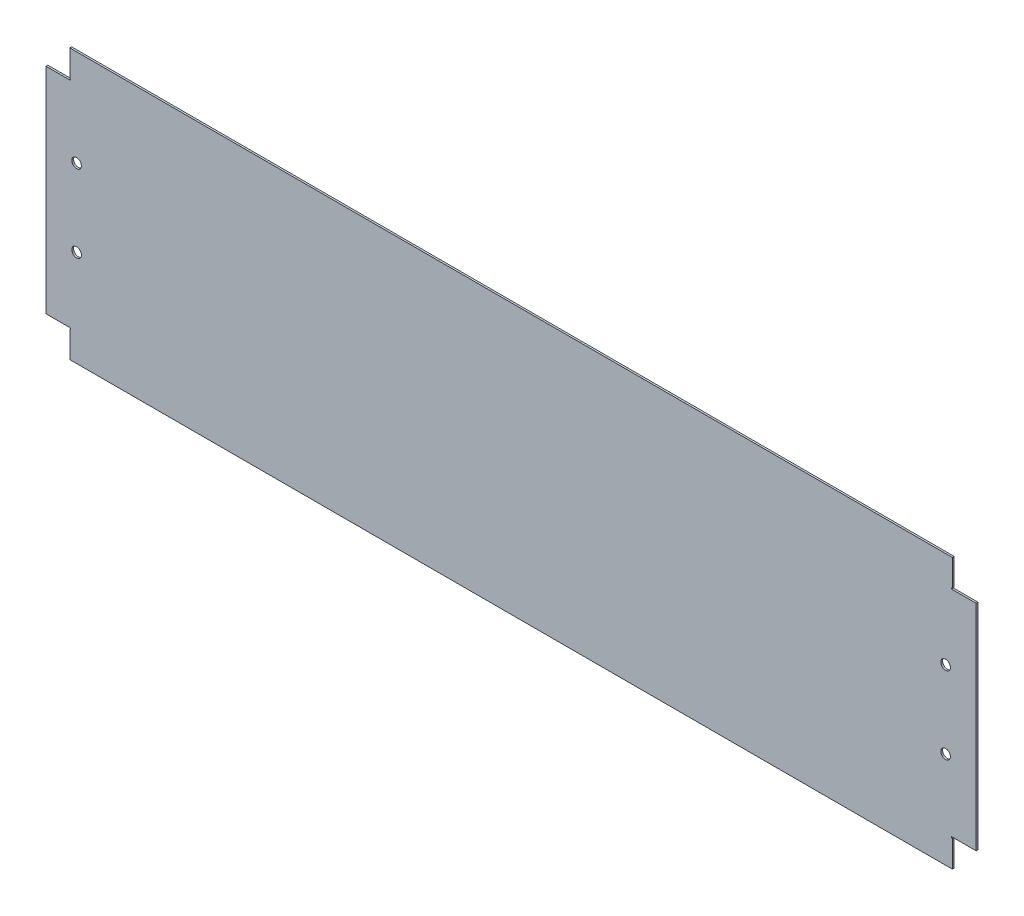
ISO-10303-21;
HEADER;
FILE_DESCRIPTION(('STEP AP214'),'2;1');
FILE_NAME('part.step','',(''),(''),'','','');
FILE_SCHEMA(('AUTOMOTIVE_DESIGN { 1 0 10303 214 1 1 1 1 }'));
ENDSEC;
DATA;
#1=APPLICATION_CONTEXT('core data for automotive mechanical design processes');
#2=APPLICATION_PROTOCOL_DEFINITION('international standard','automotive_design',2000,#1);
#3=PRODUCT_CONTEXT('',#1,'mechanical');
#4=PRODUCT('Part','Part','',(#3));
#5=PRODUCT_RELATED_PRODUCT_CATEGORY('part','',(#4));
#6=PRODUCT_DEFINITION_FORMATION('','',#4);
#7=PRODUCT_DEFINITION_CONTEXT('part definition',#1,'design');
#8=PRODUCT_DEFINITION('design','',#6,#7);
#9=PRODUCT_DEFINITION_SHAPE('','',#8);
#10=(LENGTH_UNIT() NAMED_UNIT(*) SI_UNIT(.MILLI.,.METRE.));
#11=(NAMED_UNIT(*) PLANE_ANGLE_UNIT() SI_UNIT($,.RADIAN.));
#12=(NAMED_UNIT(*) SI_UNIT($,.STERADIAN.) SOLID_ANGLE_UNIT());
#13=UNCERTAINTY_MEASURE_WITH_UNIT(LENGTH_MEASURE(1.E-05),#10,'distance_accuracy_value','');
#14=(GEOMETRIC_REPRESENTATION_CONTEXT(3) GLOBAL_UNCERTAINTY_ASSIGNED_CONTEXT((#13)) GLOBAL_UNIT_ASSIGNED_CONTEXT((#10,
#11,#12)) REPRESENTATION_CONTEXT('',''));
#15=CARTESIAN_POINT('',(0.,0.,0.));
#16=DIRECTION('',(0.,0.,1.));
#17=DIRECTION('',(1.,0.,0.));
#18=AXIS2_PLACEMENT_3D('',#15,#16,#17);
#19=CARTESIAN_POINT('',(-362.077,88.9,-1.52399999999997));
#20=DIRECTION('',(-1.,0.,0.));
#21=DIRECTION('',(0.,0.,1.));
#22=AXIS2_PLACEMENT_3D('',#19,#20,#21);
#23=PLANE('',#22);
#24=DIRECTION('',(0.,0.,1.));
#25=VECTOR('',#24,1.);
#26=CARTESIAN_POINT('',(-362.077,88.138,-1.52399999999997));
#27=LINE('',#26,#25);
#28=CARTESIAN_POINT('',(-362.077,88.138,-1.524));
#29=VERTEX_POINT('',#28);
#30=CARTESIAN_POINT('',(-362.077,88.138,0.));
#31=VERTEX_POINT('',#30);
#32=EDGE_CURVE('E394',#29,#31,#27,.T.);
#33=ORIENTED_EDGE('',*,*,#32,.T.);
#34=DIRECTION('',(0.,1.,0.));
#35=VECTOR('',#34,1.);
#36=CARTESIAN_POINT('',(-362.077,0.,0.));
#37=LINE('',#36,#35);
#38=CARTESIAN_POINT('',(-362.077,88.9,0.));
#39=VERTEX_POINT('',#38);
#40=EDGE_CURVE('E13',#31,#39,#37,.T.);
#41=ORIENTED_EDGE('',*,*,#40,.T.);
#42=DIRECTION('',(0.,0.,1.));
#43=VECTOR('',#42,1.);
#44=CARTESIAN_POINT('',(-362.077,88.9,-1.52399999999997));
#45=LINE('',#44,#43);
#46=CARTESIAN_POINT('',(-362.077,88.9,-1.524));
#47=VERTEX_POINT('',#46);
#48=EDGE_CURVE('E391',#47,#39,#45,.T.);
#49=ORIENTED_EDGE('',*,*,#48,.F.);
#50=DIRECTION('',(0.,-1.,0.));
#51=VECTOR('',#50,1.);
#52=CARTESIAN_POINT('',(-362.077,88.9,-1.52399999999997));
#53=LINE('',#52,#51);
#54=EDGE_CURVE('E151',#47,#29,#53,.T.);
#55=ORIENTED_EDGE('',*,*,#54,.T.);
#56=EDGE_LOOP('',(#33,#41,#49,#55));
#57=FACE_BOUND('',#56,.T.);
#58=ADVANCED_FACE('F135',(#57),#23,.T.);
#59=CARTESIAN_POINT('',(-362.077,-88.138,-1.52399999999997));
#60=DIRECTION('',(-1.,0.,0.));
#61=DIRECTION('',(0.,0.,1.));
#62=AXIS2_PLACEMENT_3D('',#59,#60,#61);
#63=PLANE('',#62);
#64=DIRECTION('',(0.,0.,1.));
#65=VECTOR('',#64,1.);
#66=CARTESIAN_POINT('',(-362.077,-88.9,-1.52399999999997));
#67=LINE('',#66,#65);
#68=CARTESIAN_POINT('',(-362.077,-88.9,-1.524));
#69=VERTEX_POINT('',#68);
#70=CARTESIAN_POINT('',(-362.077,-88.9,0.));
#71=VERTEX_POINT('',#70);
#72=EDGE_CURVE('E384',#69,#71,#67,.T.);
#73=ORIENTED_EDGE('',*,*,#72,.T.);
#74=DIRECTION('',(0.,1.,0.));
#75=VECTOR('',#74,1.);
#76=CARTESIAN_POINT('',(-362.077,0.,0.));
#77=LINE('',#76,#75);
#78=CARTESIAN_POINT('',(-362.077,-88.138,0.));
#79=VERTEX_POINT('',#78);
#80=EDGE_CURVE('E144',#71,#79,#77,.T.);
#81=ORIENTED_EDGE('',*,*,#80,.T.);
#82=DIRECTION('',(0.,0.,1.));
#83=VECTOR('',#82,1.);
#84=CARTESIAN_POINT('',(-362.077,-88.138,-1.52399999999997));
#85=LINE('',#84,#83);
#86=CARTESIAN_POINT('',(-362.077,-88.138,-1.524));
#87=VERTEX_POINT('',#86);
#88=EDGE_CURVE('E403',#87,#79,#85,.T.);
#89=ORIENTED_EDGE('',*,*,#88,.F.);
#90=DIRECTION('',(0.,-1.,0.));
#91=VECTOR('',#90,1.);
#92=CARTESIAN_POINT('',(-362.077,-88.138,-1.52399999999997));
#93=LINE('',#92,#91);
#94=EDGE_CURVE('E399',#87,#69,#93,.T.);
#95=ORIENTED_EDGE('',*,*,#94,.T.);
#96=EDGE_LOOP('',(#73,#81,#89,#95));
#97=FACE_BOUND('',#96,.T.);
#98=ADVANCED_FACE('F534',(#97),#63,.T.);
#99=CARTESIAN_POINT('',(-362.077,-88.9,-1.52399999999997));
#100=DIRECTION('',(0.,1.,0.));
#101=DIRECTION('',(0.,0.,1.));
#102=AXIS2_PLACEMENT_3D('',#99,#100,#101);
#103=PLANE('',#102);
#104=DIRECTION('',(0.,0.,1.));
#105=VECTOR('',#104,1.);
#106=CARTESIAN_POINT('',(-362.839,-88.9,-1.524));
#107=LINE('',#106,#105);
#108=CARTESIAN_POINT('',(-362.839,-88.9,-1.524));
#109=VERTEX_POINT('',#108);
#110=CARTESIAN_POINT('',(-362.839,-88.9,0.));
#111=VERTEX_POINT('',#110);
#112=EDGE_CURVE('E526',#109,#111,#107,.T.);
#113=ORIENTED_EDGE('',*,*,#112,.T.);
#114=DIRECTION('',(1.,0.,0.));
#115=VECTOR('',#114,1.);
#116=CARTESIAN_POINT('',(0.,-88.9,0.));
#117=LINE('',#116,#115);
#118=EDGE_CURVE('E430',#111,#71,#117,.T.);
#119=ORIENTED_EDGE('',*,*,#118,.T.);
#120=ORIENTED_EDGE('',*,*,#72,.F.);
#121=DIRECTION('',(-1.,0.,0.));
#122=VECTOR('',#121,1.);
#123=CARTESIAN_POINT('',(-362.077,-88.9,-1.52399999999997));
#124=LINE('',#123,#122);
#125=EDGE_CURVE('E404',#69,#109,#124,.T.);
#126=ORIENTED_EDGE('',*,*,#125,.T.);
#127=EDGE_LOOP('',(#113,#119,#120,#126));
#128=FACE_BOUND('',#127,.T.);
#129=ADVANCED_FACE('F542',(#128),#103,.T.);
#130=CARTESIAN_POINT('',(-365.887,88.9,-1.52399999999997));
#131=DIRECTION('',(0.,-1.,0.));
#132=DIRECTION('',(0.,0.,-1.));
#133=AXIS2_PLACEMENT_3D('',#130,#131,#132);
#134=PLANE('',#133);
#135=ORIENTED_EDGE('',*,*,#48,.T.);
#136=DIRECTION('',(-1.,0.,0.));
#137=VECTOR('',#136,1.);
#138=CARTESIAN_POINT('',(0.,88.9,0.));
#139=LINE('',#138,#137);
#140=CARTESIAN_POINT('',(-362.839,88.9,0.));
#141=VERTEX_POINT('',#140);
#142=EDGE_CURVE('E426',#39,#141,#139,.T.);
#143=ORIENTED_EDGE('',*,*,#142,.T.);
#144=DIRECTION('',(0.,0.,-1.));
#145=VECTOR('',#144,1.);
#146=CARTESIAN_POINT('',(-362.839,88.9,-1.524));
#147=LINE('',#146,#145);
#148=CARTESIAN_POINT('',(-362.839,88.9,-1.52399999999997));
#149=VERTEX_POINT('',#148);
#150=EDGE_CURVE('E522',#141,#149,#147,.T.);
#151=ORIENTED_EDGE('',*,*,#150,.T.);
#152=DIRECTION('',(1.,0.,0.));
#153=VECTOR('',#152,1.);
#154=CARTESIAN_POINT('',(-365.887,88.9,-1.52399999999997));
#155=LINE('',#154,#153);
#156=EDGE_CURVE('E385',#149,#47,#155,.T.);
#157=ORIENTED_EDGE('',*,*,#156,.T.);
#158=EDGE_LOOP('',(#135,#143,#151,#157));
#159=FACE_BOUND('',#158,.T.);
#160=ADVANCED_FACE('F595',(#159),#134,.T.);
#161=CARTESIAN_POINT('',(-362.077,88.138,-1.52399999999997));
#162=DIRECTION('',(0.,1.,0.));
#163=DIRECTION('',(0.,0.,1.));
#164=AXIS2_PLACEMENT_3D('',#161,#162,#163);
#165=PLANE('',#164);
#166=DIRECTION('',(-1.,0.,0.));
#167=VECTOR('',#166,1.);
#168=CARTESIAN_POINT('',(-362.077,88.138,-1.52399999999997));
#169=LINE('',#168,#167);
#170=CARTESIAN_POINT('',(-382.383962531012,88.138,-1.52399999999991));
#171=VERTEX_POINT('',#170);
#172=EDGE_CURVE('E156',#29,#171,#169,.T.);
#173=ORIENTED_EDGE('',*,*,#172,.T.);
#174=DIRECTION('',(0.,0.,-1.));
#175=VECTOR('',#174,1.);
#176=CARTESIAN_POINT('',(-382.383962531012,88.138,1.11022302462516E-13));
#177=LINE('',#176,#175);
#178=CARTESIAN_POINT('',(-382.383962531012,88.138,1.66533453693773E-13));
#179=VERTEX_POINT('',#178);
#180=EDGE_CURVE('E346',#179,#171,#177,.T.);
#181=ORIENTED_EDGE('',*,*,#180,.F.);
#182=DIRECTION('',(1.,0.,0.));
#183=VECTOR('',#182,1.);
#184=CARTESIAN_POINT('',(0.,88.138,0.));
#185=LINE('',#184,#183);
#186=EDGE_CURVE('E422',#179,#31,#185,.T.);
#187=ORIENTED_EDGE('',*,*,#186,.T.);
#188=ORIENTED_EDGE('',*,*,#32,.F.);
#189=EDGE_LOOP('',(#173,#181,#187,#188));
#190=FACE_BOUND('',#189,.T.);
#191=ADVANCED_FACE('F593',(#190),#165,.T.);
#192=CARTESIAN_POINT('',(-362.839,-88.138,-1.52399999999997));
#193=DIRECTION('',(0.,-1.,0.));
#194=DIRECTION('',(0.,0.,-1.));
#195=AXIS2_PLACEMENT_3D('',#192,#193,#194);
#196=PLANE('',#195);
#197=ORIENTED_EDGE('',*,*,#88,.T.);
#198=DIRECTION('',(-1.,0.,0.));
#199=VECTOR('',#198,1.);
#200=CARTESIAN_POINT('',(0.,-88.138,0.));
#201=LINE('',#200,#199);
#202=CARTESIAN_POINT('',(-382.383962531012,-88.1380000000001,1.11022302462516E-13));
#203=VERTEX_POINT('',#202);
#204=EDGE_CURVE('E388',#79,#203,#201,.T.);
#205=ORIENTED_EDGE('',*,*,#204,.T.);
#206=DIRECTION('',(0.,0.,-1.));
#207=VECTOR('',#206,1.);
#208=CARTESIAN_POINT('',(-382.383962531012,-88.1380000000001,0.));
#209=LINE('',#208,#207);
#210=CARTESIAN_POINT('',(-382.383962531012,-88.1380000000001,-1.52399999999991));
#211=VERTEX_POINT('',#210);
#212=EDGE_CURVE('E338',#203,#211,#209,.T.);
#213=ORIENTED_EDGE('',*,*,#212,.T.);
#214=DIRECTION('',(1.,0.,0.));
#215=VECTOR('',#214,1.);
#216=CARTESIAN_POINT('',(-362.839,-88.138,-1.52399999999997));
#217=LINE('',#216,#215);
#218=EDGE_CURVE('E395',#211,#87,#217,.T.);
#219=ORIENTED_EDGE('',*,*,#218,.T.);
#220=EDGE_LOOP('',(#197,#205,#213,#219));
#221=FACE_BOUND('',#220,.T.);
#222=ADVANCED_FACE('F537',(#221),#196,.T.);
#223=CARTESIAN_POINT('',(0.,0.,-1.524));
#224=DIRECTION('',(0.,0.,-1.));
#225=DIRECTION('',(-1.,0.,0.));
#226=AXIS2_PLACEMENT_3D('',#223,#224,#225);
#227=PLANE('',#226);
#228=CARTESIAN_POINT('',(-357.251,-31.75,-1.524));
#229=DIRECTION('',(0.,0.,-1.));
#230=DIRECTION('',(-1.,0.,0.));
#231=AXIS2_PLACEMENT_3D('',#228,#229,#230);
#232=CIRCLE('',#231,3.9624);
#233=CARTESIAN_POINT('',(-361.2134,-31.75,-1.524));
#234=VERTEX_POINT('',#233);
#235=EDGE_CURVE('E380',#234,#234,#232,.T.);
#236=ORIENTED_EDGE('',*,*,#235,.F.);
#237=EDGE_LOOP('',(#236));
#238=FACE_BOUND('',#237,.T.);
#239=CARTESIAN_POINT('',(357.251,31.75,-1.524));
#240=DIRECTION('',(0.,0.,-1.));
#241=DIRECTION('',(-1.,0.,0.));
#242=AXIS2_PLACEMENT_3D('',#239,#240,#241);
#243=CIRCLE('',#242,3.9624);
#244=CARTESIAN_POINT('',(353.2886,31.75,-1.524));
#245=VERTEX_POINT('',#244);
#246=EDGE_CURVE('E376',#245,#245,#243,.T.);
#247=ORIENTED_EDGE('',*,*,#246,.F.);
#248=EDGE_LOOP('',(#247));
#249=FACE_BOUND('',#248,.T.);
#250=CARTESIAN_POINT('',(357.251,-31.75,-1.524));
#251=DIRECTION('',(0.,0.,-1.));
#252=DIRECTION('',(-1.,0.,0.));
#253=AXIS2_PLACEMENT_3D('',#250,#251,#252);
#254=CIRCLE('',#253,3.9624);
#255=CARTESIAN_POINT('',(353.2886,-31.75,-1.524));
#256=VERTEX_POINT('',#255);
#257=EDGE_CURVE('E372',#256,#256,#254,.T.);
#258=ORIENTED_EDGE('',*,*,#257,.F.);
#259=EDGE_LOOP('',(#258));
#260=FACE_BOUND('',#259,.T.);
#261=CARTESIAN_POINT('',(-357.251,31.75,-1.524));
#262=DIRECTION('',(0.,0.,-1.));
#263=DIRECTION('',(-1.,0.,0.));
#264=AXIS2_PLACEMENT_3D('',#261,#262,#263);
#265=CIRCLE('',#264,3.9624);
#266=CARTESIAN_POINT('',(-361.2134,31.75,-1.524));
#267=VERTEX_POINT('',#266);
#268=EDGE_CURVE('E368',#267,#267,#265,.T.);
#269=ORIENTED_EDGE('',*,*,#268,.F.);
#270=EDGE_LOOP('',(#269));
#271=FACE_BOUND('',#270,.T.);
#272=ORIENTED_EDGE('',*,*,#54,.F.);
#273=ORIENTED_EDGE('',*,*,#156,.F.);
#274=DIRECTION('',(0.,1.,0.));
#275=VECTOR('',#274,1.);
#276=CARTESIAN_POINT('',(-362.839,94.488,-1.524));
#277=LINE('',#276,#275);
#278=CARTESIAN_POINT('',(-362.839,110.984962531012,-1.5239999999999));
#279=VERTEX_POINT('',#278);
#280=EDGE_CURVE('E502',#149,#279,#277,.T.);
#281=ORIENTED_EDGE('',*,*,#280,.T.);
#282=DIRECTION('',(-1.,0.,0.));
#283=VECTOR('',#282,1.);
#284=CARTESIAN_POINT('',(0.,110.984962531012,-1.5239999999999));
#285=LINE('',#284,#283);
#286=CARTESIAN_POINT('',(362.839,110.984962531012,-1.5239999999999));
#287=VERTEX_POINT('',#286);
#288=EDGE_CURVE('E294',#279,#287,#285,.F.);
#289=ORIENTED_EDGE('',*,*,#288,.T.);
#290=DIRECTION('',(0.,-1.,0.));
#291=VECTOR('',#290,1.);
#292=CARTESIAN_POINT('',(362.839,94.488,-1.524));
#293=LINE('',#292,#291);
#294=CARTESIAN_POINT('',(362.839,88.9,-1.524));
#295=VERTEX_POINT('',#294);
#296=EDGE_CURVE('E284',#287,#295,#293,.T.);
#297=ORIENTED_EDGE('',*,*,#296,.T.);
#298=DIRECTION('',(1.,0.,0.));
#299=VECTOR('',#298,1.);
#300=CARTESIAN_POINT('',(362.077,88.9,-1.52399999999997));
#301=LINE('',#300,#299);
#302=CARTESIAN_POINT('',(362.077,88.9,-1.524));
#303=VERTEX_POINT('',#302);
#304=EDGE_CURVE('E458',#303,#295,#301,.T.);
#305=ORIENTED_EDGE('',*,*,#304,.F.);
#306=DIRECTION('',(0.,1.,0.));
#307=VECTOR('',#306,1.);
#308=CARTESIAN_POINT('',(362.077,88.138,-1.52399999999997));
#309=LINE('',#308,#307);
#310=CARTESIAN_POINT('',(362.077,88.138,-1.524));
#311=VERTEX_POINT('',#310);
#312=EDGE_CURVE('E453',#311,#303,#309,.T.);
#313=ORIENTED_EDGE('',*,*,#312,.F.);
#314=DIRECTION('',(-1.,0.,0.));
#315=VECTOR('',#314,1.);
#316=CARTESIAN_POINT('',(362.839,88.138,-1.52399999999997));
#317=LINE('',#316,#315);
#318=CARTESIAN_POINT('',(382.383962531012,88.138,-1.52399999999991));
#319=VERTEX_POINT('',#318);
#320=EDGE_CURVE('E449',#319,#311,#317,.T.);
#321=ORIENTED_EDGE('',*,*,#320,.F.);
#322=DIRECTION('',(0.,-1.,0.));
#323=VECTOR('',#322,1.);
#324=CARTESIAN_POINT('',(382.383962531012,1.1249206817415E-13,-1.52399999999991));
#325=LINE('',#324,#323);
#326=CARTESIAN_POINT('',(382.383962531012,-88.138,-1.52399999999991));
#327=VERTEX_POINT('',#326);
#328=EDGE_CURVE('E310',#319,#327,#325,.T.);
#329=ORIENTED_EDGE('',*,*,#328,.T.);
#330=DIRECTION('',(1.,0.,0.));
#331=VECTOR('',#330,1.);
#332=CARTESIAN_POINT('',(362.077,-88.138,-1.52399999999997));
#333=LINE('',#332,#331);
#334=CARTESIAN_POINT('',(362.077,-88.138,-1.524));
#335=VERTEX_POINT('',#334);
#336=EDGE_CURVE('E445',#335,#327,#333,.T.);
#337=ORIENTED_EDGE('',*,*,#336,.F.);
#338=DIRECTION('',(0.,1.,0.));
#339=VECTOR('',#338,1.);
#340=CARTESIAN_POINT('',(362.077,-88.9,-1.52399999999997));
#341=LINE('',#340,#339);
#342=CARTESIAN_POINT('',(362.077,-88.9,-1.524));
#343=VERTEX_POINT('',#342);
#344=EDGE_CURVE('E440',#343,#335,#341,.T.);
#345=ORIENTED_EDGE('',*,*,#344,.F.);
#346=DIRECTION('',(-1.,0.,0.));
#347=VECTOR('',#346,1.);
#348=CARTESIAN_POINT('',(365.887,-88.9,-1.52399999999997));
#349=LINE('',#348,#347);
#350=CARTESIAN_POINT('',(362.839,-88.9,-1.52399999999997));
#351=VERTEX_POINT('',#350);
#352=EDGE_CURVE('E435',#351,#343,#349,.T.);
#353=ORIENTED_EDGE('',*,*,#352,.F.);
#354=DIRECTION('',(0.,-1.,0.));
#355=VECTOR('',#354,1.);
#356=CARTESIAN_POINT('',(362.839,-94.488,-1.524));
#357=LINE('',#356,#355);
#358=CARTESIAN_POINT('',(362.839,-110.984962531012,-1.5239999999999));
#359=VERTEX_POINT('',#358);
#360=EDGE_CURVE('E486',#351,#359,#357,.T.);
#361=ORIENTED_EDGE('',*,*,#360,.T.);
#362=DIRECTION('',(-1.,0.,0.));
#363=VECTOR('',#362,1.);
#364=CARTESIAN_POINT('',(0.,-110.984962531012,-1.5239999999999));
#365=LINE('',#364,#363);
#366=CARTESIAN_POINT('',(-362.839,-110.984962531012,-1.5239999999999));
#367=VERTEX_POINT('',#366);
#368=EDGE_CURVE('E327',#359,#367,#365,.T.);
#369=ORIENTED_EDGE('',*,*,#368,.T.);
#370=DIRECTION('',(0.,1.,0.));
#371=VECTOR('',#370,1.);
#372=CARTESIAN_POINT('',(-362.839,-94.488,-1.524));
#373=LINE('',#372,#371);
#374=EDGE_CURVE('E490',#367,#109,#373,.T.);
#375=ORIENTED_EDGE('',*,*,#374,.T.);
#376=ORIENTED_EDGE('',*,*,#125,.F.);
#377=ORIENTED_EDGE('',*,*,#94,.F.);
#378=ORIENTED_EDGE('',*,*,#218,.F.);
#379=DIRECTION('',(0.,1.,0.));
#380=VECTOR('',#379,1.);
#381=CARTESIAN_POINT('',(-382.383962531012,-1.1249206817415E-13,-1.52399999999991));
#382=LINE('',#381,#380);
#383=EDGE_CURVE('E343',#211,#171,#382,.T.);
#384=ORIENTED_EDGE('',*,*,#383,.T.);
#385=ORIENTED_EDGE('',*,*,#172,.F.);
#386=EDGE_LOOP('',(#272,#273,#281,#289,#297,#305,#313,#321,#329,#337,#345,#353,#361,#369,#375,
#376,#377,#378,#384,#385));
#387=FACE_BOUND('',#386,.T.);
#388=ADVANCED_FACE('F540',(#238,#249,#260,#271,#387),#227,.T.);
#389=CARTESIAN_POINT('',(0.,0.,0.));
#390=DIRECTION('',(0.,0.,-1.));
#391=DIRECTION('',(-1.,0.,0.));
#392=AXIS2_PLACEMENT_3D('',#389,#390,#391);
#393=PLANE('',#392);
#394=CARTESIAN_POINT('',(-357.251,-31.75,0.));
#395=DIRECTION('',(0.,0.,1.));
#396=DIRECTION('',(1.,0.,0.));
#397=AXIS2_PLACEMENT_3D('',#394,#395,#396);
#398=CIRCLE('',#397,3.9624);
#399=CARTESIAN_POINT('',(-353.2886,-31.75,0.));
#400=VERTEX_POINT('',#399);
#401=EDGE_CURVE('E357',#400,#400,#398,.T.);
#402=ORIENTED_EDGE('',*,*,#401,.F.);
#403=EDGE_LOOP('',(#402));
#404=FACE_BOUND('',#403,.T.);
#405=CARTESIAN_POINT('',(357.251,31.75,0.));
#406=DIRECTION('',(0.,0.,1.));
#407=DIRECTION('',(1.,0.,0.));
#408=AXIS2_PLACEMENT_3D('',#405,#406,#407);
#409=CIRCLE('',#408,3.9624);
#410=CARTESIAN_POINT('',(361.2134,31.75,0.));
#411=VERTEX_POINT('',#410);
#412=EDGE_CURVE('E356',#411,#411,#409,.T.);
#413=ORIENTED_EDGE('',*,*,#412,.F.);
#414=EDGE_LOOP('',(#413));
#415=FACE_BOUND('',#414,.T.);
#416=CARTESIAN_POINT('',(357.251,-31.75,0.));
#417=DIRECTION('',(0.,0.,1.));
#418=DIRECTION('',(1.,0.,0.));
#419=AXIS2_PLACEMENT_3D('',#416,#417,#418);
#420=CIRCLE('',#419,3.9624);
#421=CARTESIAN_POINT('',(361.2134,-31.75,0.));
#422=VERTEX_POINT('',#421);
#423=EDGE_CURVE('E342',#422,#422,#420,.T.);
#424=ORIENTED_EDGE('',*,*,#423,.F.);
#425=EDGE_LOOP('',(#424));
#426=FACE_BOUND('',#425,.T.);
#427=CARTESIAN_POINT('',(-357.251,31.75,0.));
#428=DIRECTION('',(0.,0.,1.));
#429=DIRECTION('',(1.,0.,0.));
#430=AXIS2_PLACEMENT_3D('',#427,#428,#429);
#431=CIRCLE('',#430,3.9624);
#432=CARTESIAN_POINT('',(-353.2886,31.75,0.));
#433=VERTEX_POINT('',#432);
#434=EDGE_CURVE('E361',#433,#433,#431,.T.);
#435=ORIENTED_EDGE('',*,*,#434,.F.);
#436=EDGE_LOOP('',(#435));
#437=FACE_BOUND('',#436,.T.);
#438=ORIENTED_EDGE('',*,*,#142,.F.);
#439=ORIENTED_EDGE('',*,*,#40,.F.);
#440=ORIENTED_EDGE('',*,*,#186,.F.);
#441=DIRECTION('',(0.,-1.,0.));
#442=VECTOR('',#441,1.);
#443=CARTESIAN_POINT('',(-382.383962531012,-88.1380000000001,1.11022302462516E-13));
#444=LINE('',#443,#442);
#445=EDGE_CURVE('E326',#203,#179,#444,.F.);
#446=ORIENTED_EDGE('',*,*,#445,.F.);
#447=ORIENTED_EDGE('',*,*,#204,.F.);
#448=ORIENTED_EDGE('',*,*,#80,.F.);
#449=ORIENTED_EDGE('',*,*,#118,.F.);
#450=DIRECTION('',(0.,1.,0.));
#451=VECTOR('',#450,1.);
#452=CARTESIAN_POINT('',(-362.839,-94.488,0.));
#453=LINE('',#452,#451);
#454=CARTESIAN_POINT('',(-362.839,-110.984962531012,0.));
#455=VERTEX_POINT('',#454);
#456=EDGE_CURVE('E495',#455,#111,#453,.T.);
#457=ORIENTED_EDGE('',*,*,#456,.F.);
#458=DIRECTION('',(1.,0.,0.));
#459=VECTOR('',#458,1.);
#460=CARTESIAN_POINT('',(362.839,-110.984962531012,0.));
#461=LINE('',#460,#459);
#462=CARTESIAN_POINT('',(362.839,-110.984962531012,0.));
#463=VERTEX_POINT('',#462);
#464=EDGE_CURVE('E309',#463,#455,#461,.F.);
#465=ORIENTED_EDGE('',*,*,#464,.F.);
#466=DIRECTION('',(0.,-1.,0.));
#467=VECTOR('',#466,1.);
#468=CARTESIAN_POINT('',(362.839,-94.488,0.));
#469=LINE('',#468,#467);
#470=CARTESIAN_POINT('',(362.839,-88.9,0.));
#471=VERTEX_POINT('',#470);
#472=EDGE_CURVE('E487',#471,#463,#469,.T.);
#473=ORIENTED_EDGE('',*,*,#472,.F.);
#474=DIRECTION('',(1.,0.,0.));
#475=VECTOR('',#474,1.);
#476=CARTESIAN_POINT('',(0.,-88.9,0.));
#477=LINE('',#476,#475);
#478=CARTESIAN_POINT('',(362.077,-88.9,0.));
#479=VERTEX_POINT('',#478);
#480=EDGE_CURVE('E480',#479,#471,#477,.T.);
#481=ORIENTED_EDGE('',*,*,#480,.F.);
#482=DIRECTION('',(0.,-1.,0.));
#483=VECTOR('',#482,1.);
#484=CARTESIAN_POINT('',(362.077,0.,0.));
#485=LINE('',#484,#483);
#486=CARTESIAN_POINT('',(362.077,-88.138,0.));
#487=VERTEX_POINT('',#486);
#488=EDGE_CURVE('E518',#487,#479,#485,.T.);
#489=ORIENTED_EDGE('',*,*,#488,.F.);
#490=DIRECTION('',(-1.,0.,0.));
#491=VECTOR('',#490,1.);
#492=CARTESIAN_POINT('',(0.,-88.138,0.));
#493=LINE('',#492,#491);
#494=CARTESIAN_POINT('',(382.383962531012,-88.138,1.66533453693773E-13));
#495=VERTEX_POINT('',#494);
#496=EDGE_CURVE('E476',#495,#487,#493,.T.);
#497=ORIENTED_EDGE('',*,*,#496,.F.);
#498=DIRECTION('',(0.,1.,0.));
#499=VECTOR('',#498,1.);
#500=CARTESIAN_POINT('',(382.383962531012,88.138,1.11022302462516E-13));
#501=LINE('',#500,#499);
#502=CARTESIAN_POINT('',(382.383962531012,88.138,1.11022302462516E-13));
#503=VERTEX_POINT('',#502);
#504=EDGE_CURVE('E318',#503,#495,#501,.F.);
#505=ORIENTED_EDGE('',*,*,#504,.F.);
#506=DIRECTION('',(1.,0.,0.));
#507=VECTOR('',#506,1.);
#508=CARTESIAN_POINT('',(0.,88.138,0.));
#509=LINE('',#508,#507);
#510=CARTESIAN_POINT('',(362.077,88.138,0.));
#511=VERTEX_POINT('',#510);
#512=EDGE_CURVE('E439',#511,#503,#509,.T.);
#513=ORIENTED_EDGE('',*,*,#512,.F.);
#514=DIRECTION('',(0.,-1.,0.));
#515=VECTOR('',#514,1.);
#516=CARTESIAN_POINT('',(362.077,0.,0.));
#517=LINE('',#516,#515);
#518=CARTESIAN_POINT('',(362.077,88.9,0.));
#519=VERTEX_POINT('',#518);
#520=EDGE_CURVE('E514',#519,#511,#517,.T.);
#521=ORIENTED_EDGE('',*,*,#520,.F.);
#522=DIRECTION('',(-1.,0.,0.));
#523=VECTOR('',#522,1.);
#524=CARTESIAN_POINT('',(0.,88.9,0.));
#525=LINE('',#524,#523);
#526=CARTESIAN_POINT('',(362.839,88.9,0.));
#527=VERTEX_POINT('',#526);
#528=EDGE_CURVE('E279',#527,#519,#525,.T.);
#529=ORIENTED_EDGE('',*,*,#528,.F.);
#530=DIRECTION('',(0.,-1.,0.));
#531=VECTOR('',#530,1.);
#532=CARTESIAN_POINT('',(362.839,94.488,0.));
#533=LINE('',#532,#531);
#534=CARTESIAN_POINT('',(362.839,110.984962531012,0.));
#535=VERTEX_POINT('',#534);
#536=EDGE_CURVE('E273',#535,#527,#533,.T.);
#537=ORIENTED_EDGE('',*,*,#536,.F.);
#538=DIRECTION('',(1.,0.,0.));
#539=VECTOR('',#538,1.);
#540=CARTESIAN_POINT('',(362.839,110.984962531012,0.));
#541=LINE('',#540,#539);
#542=CARTESIAN_POINT('',(-362.839,110.984962531012,0.));
#543=VERTEX_POINT('',#542);
#544=EDGE_CURVE('E277',#543,#535,#541,.T.);
#545=ORIENTED_EDGE('',*,*,#544,.F.);
#546=DIRECTION('',(0.,1.,0.));
#547=VECTOR('',#546,1.);
#548=CARTESIAN_POINT('',(-362.839,94.488,0.));
#549=LINE('',#548,#547);
#550=EDGE_CURVE('E283',#141,#543,#549,.T.);
#551=ORIENTED_EDGE('',*,*,#550,.F.);
#552=EDGE_LOOP('',(#438,#439,#440,#446,#447,#448,#449,#457,#465,#473,#481,#489,#497,#505,#513,
#521,#529,#537,#545,#551));
#553=FACE_BOUND('',#552,.T.);
#554=ADVANCED_FACE('F137',(#404,#415,#426,#437,#553),#393,.F.);
#555=CARTESIAN_POINT('',(-362.839,-94.488,-1.524));
#556=DIRECTION('',(1.,0.,0.));
#557=DIRECTION('',(0.,0.,-1.));
#558=AXIS2_PLACEMENT_3D('',#555,#556,#557);
#559=PLANE('',#558);
#560=ORIENTED_EDGE('',*,*,#112,.F.);
#561=ORIENTED_EDGE('',*,*,#374,.F.);
#562=DIRECTION('',(0.,0.,-1.));
#563=VECTOR('',#562,1.);
#564=CARTESIAN_POINT('',(-362.839,-110.984962531012,0.));
#565=LINE('',#564,#563);
#566=EDGE_CURVE('E331',#455,#367,#565,.T.);
#567=ORIENTED_EDGE('',*,*,#566,.F.);
#568=ORIENTED_EDGE('',*,*,#456,.T.);
#569=EDGE_LOOP('',(#560,#561,#567,#568));
#570=FACE_BOUND('',#569,.T.);
#571=ADVANCED_FACE('F546',(#570),#559,.F.);
#572=CARTESIAN_POINT('',(-362.839,94.488,-1.524));
#573=DIRECTION('',(1.,0.,0.));
#574=DIRECTION('',(0.,0.,-1.));
#575=AXIS2_PLACEMENT_3D('',#572,#573,#574);
#576=PLANE('',#575);
#577=ORIENTED_EDGE('',*,*,#150,.F.);
#578=ORIENTED_EDGE('',*,*,#550,.T.);
#579=DIRECTION('',(0.,0.,-1.));
#580=VECTOR('',#579,1.);
#581=CARTESIAN_POINT('',(-362.839,110.984962531012,0.));
#582=LINE('',#581,#580);
#583=EDGE_CURVE('E299',#543,#279,#582,.T.);
#584=ORIENTED_EDGE('',*,*,#583,.T.);
#585=ORIENTED_EDGE('',*,*,#280,.F.);
#586=EDGE_LOOP('',(#577,#578,#584,#585));
#587=FACE_BOUND('',#586,.T.);
#588=ADVANCED_FACE('F644',(#587),#576,.F.);
#589=CARTESIAN_POINT('',(362.839,-94.488,-1.524));
#590=DIRECTION('',(-1.,0.,0.));
#591=DIRECTION('',(0.,-1.,0.));
#592=AXIS2_PLACEMENT_3D('',#589,#590,#591);
#593=PLANE('',#592);
#594=ORIENTED_EDGE('',*,*,#472,.T.);
#595=DIRECTION('',(0.,0.,-1.));
#596=VECTOR('',#595,1.);
#597=CARTESIAN_POINT('',(362.839,-110.984962531012,0.));
#598=LINE('',#597,#596);
#599=EDGE_CURVE('E322',#463,#359,#598,.T.);
#600=ORIENTED_EDGE('',*,*,#599,.T.);
#601=ORIENTED_EDGE('',*,*,#360,.F.);
#602=DIRECTION('',(0.,0.,-1.));
#603=VECTOR('',#602,1.);
#604=CARTESIAN_POINT('',(362.839,-88.9,-1.524));
#605=LINE('',#604,#603);
#606=EDGE_CURVE('E505',#471,#351,#605,.T.);
#607=ORIENTED_EDGE('',*,*,#606,.F.);
#608=EDGE_LOOP('',(#594,#600,#601,#607));
#609=FACE_BOUND('',#608,.T.);
#610=ADVANCED_FACE('F647',(#609),#593,.F.);
#611=CARTESIAN_POINT('',(362.077,-88.9,-1.52399999999997));
#612=DIRECTION('',(1.,0.,0.));
#613=DIRECTION('',(0.,0.,-1.));
#614=AXIS2_PLACEMENT_3D('',#611,#612,#613);
#615=PLANE('',#614);
#616=DIRECTION('',(0.,0.,1.));
#617=VECTOR('',#616,1.);
#618=CARTESIAN_POINT('',(362.077,-88.138,-1.52399999999997));
#619=LINE('',#618,#617);
#620=EDGE_CURVE('E448',#335,#487,#619,.T.);
#621=ORIENTED_EDGE('',*,*,#620,.T.);
#622=ORIENTED_EDGE('',*,*,#488,.T.);
#623=DIRECTION('',(0.,0.,1.));
#624=VECTOR('',#623,1.);
#625=CARTESIAN_POINT('',(362.077,-88.9,-1.52399999999997));
#626=LINE('',#625,#624);
#627=EDGE_CURVE('E444',#343,#479,#626,.T.);
#628=ORIENTED_EDGE('',*,*,#627,.F.);
#629=ORIENTED_EDGE('',*,*,#344,.T.);
#630=EDGE_LOOP('',(#621,#622,#628,#629));
#631=FACE_BOUND('',#630,.T.);
#632=ADVANCED_FACE('F558',(#631),#615,.T.);
#633=CARTESIAN_POINT('',(362.077,88.138,-1.52399999999997));
#634=DIRECTION('',(1.,0.,0.));
#635=DIRECTION('',(0.,0.,-1.));
#636=AXIS2_PLACEMENT_3D('',#633,#634,#635);
#637=PLANE('',#636);
#638=DIRECTION('',(0.,0.,1.));
#639=VECTOR('',#638,1.);
#640=CARTESIAN_POINT('',(362.077,88.9,-1.52399999999997));
#641=LINE('',#640,#639);
#642=EDGE_CURVE('E434',#303,#519,#641,.T.);
#643=ORIENTED_EDGE('',*,*,#642,.T.);
#644=ORIENTED_EDGE('',*,*,#520,.T.);
#645=DIRECTION('',(0.,0.,1.));
#646=VECTOR('',#645,1.);
#647=CARTESIAN_POINT('',(362.077,88.138,-1.52399999999997));
#648=LINE('',#647,#646);
#649=EDGE_CURVE('E457',#311,#511,#648,.T.);
#650=ORIENTED_EDGE('',*,*,#649,.F.);
#651=ORIENTED_EDGE('',*,*,#312,.T.);
#652=EDGE_LOOP('',(#643,#644,#650,#651));
#653=FACE_BOUND('',#652,.T.);
#654=ADVANCED_FACE('F571',(#653),#637,.T.);
#655=CARTESIAN_POINT('',(362.077,88.9,-1.52399999999997));
#656=DIRECTION('',(0.,-1.,0.));
#657=DIRECTION('',(0.,0.,-1.));
#658=AXIS2_PLACEMENT_3D('',#655,#656,#657);
#659=PLANE('',#658);
#660=DIRECTION('',(0.,0.,1.));
#661=VECTOR('',#660,1.);
#662=CARTESIAN_POINT('',(362.839,88.9,-1.524));
#663=LINE('',#662,#661);
#664=EDGE_CURVE('E511',#295,#527,#663,.T.);
#665=ORIENTED_EDGE('',*,*,#664,.T.);
#666=ORIENTED_EDGE('',*,*,#528,.T.);
#667=ORIENTED_EDGE('',*,*,#642,.F.);
#668=ORIENTED_EDGE('',*,*,#304,.T.);
#669=EDGE_LOOP('',(#665,#666,#667,#668));
#670=FACE_BOUND('',#669,.T.);
#671=ADVANCED_FACE('F575',(#670),#659,.T.);
#672=CARTESIAN_POINT('',(365.887,-88.9,-1.52399999999997));
#673=DIRECTION('',(0.,1.,0.));
#674=DIRECTION('',(0.,0.,1.));
#675=AXIS2_PLACEMENT_3D('',#672,#673,#674);
#676=PLANE('',#675);
#677=ORIENTED_EDGE('',*,*,#627,.T.);
#678=ORIENTED_EDGE('',*,*,#480,.T.);
#679=ORIENTED_EDGE('',*,*,#606,.T.);
#680=ORIENTED_EDGE('',*,*,#352,.T.);
#681=EDGE_LOOP('',(#677,#678,#679,#680));
#682=FACE_BOUND('',#681,.T.);
#683=ADVANCED_FACE('F554',(#682),#676,.T.);
#684=CARTESIAN_POINT('',(362.077,-88.138,-1.52399999999997));
#685=DIRECTION('',(0.,-1.,0.));
#686=DIRECTION('',(0.,0.,-1.));
#687=AXIS2_PLACEMENT_3D('',#684,#685,#686);
#688=PLANE('',#687);
#689=ORIENTED_EDGE('',*,*,#336,.T.);
#690=DIRECTION('',(0.,0.,-1.));
#691=VECTOR('',#690,1.);
#692=CARTESIAN_POINT('',(382.383962531012,-88.138,1.66533453693773E-13));
#693=LINE('',#692,#691);
#694=EDGE_CURVE('E314',#495,#327,#693,.T.);
#695=ORIENTED_EDGE('',*,*,#694,.F.);
#696=ORIENTED_EDGE('',*,*,#496,.T.);
#697=ORIENTED_EDGE('',*,*,#620,.F.);
#698=EDGE_LOOP('',(#689,#695,#696,#697));
#699=FACE_BOUND('',#698,.T.);
#700=ADVANCED_FACE('F563',(#699),#688,.T.);
#701=CARTESIAN_POINT('',(362.839,88.138,-1.52399999999997));
#702=DIRECTION('',(0.,1.,0.));
#703=DIRECTION('',(0.,0.,1.));
#704=AXIS2_PLACEMENT_3D('',#701,#702,#703);
#705=PLANE('',#704);
#706=ORIENTED_EDGE('',*,*,#649,.T.);
#707=ORIENTED_EDGE('',*,*,#512,.T.);
#708=DIRECTION('',(0.,0.,-1.));
#709=VECTOR('',#708,1.);
#710=CARTESIAN_POINT('',(382.383962531012,88.138,1.11022302462516E-13));
#711=LINE('',#710,#709);
#712=EDGE_CURVE('E306',#503,#319,#711,.T.);
#713=ORIENTED_EDGE('',*,*,#712,.T.);
#714=ORIENTED_EDGE('',*,*,#320,.T.);
#715=EDGE_LOOP('',(#706,#707,#713,#714));
#716=FACE_BOUND('',#715,.T.);
#717=ADVANCED_FACE('F573',(#716),#705,.T.);
#718=CARTESIAN_POINT('',(362.839,94.488,-1.524));
#719=DIRECTION('',(-1.,0.,0.));
#720=DIRECTION('',(0.,0.,1.));
#721=AXIS2_PLACEMENT_3D('',#718,#719,#720);
#722=PLANE('',#721);
#723=ORIENTED_EDGE('',*,*,#664,.F.);
#724=ORIENTED_EDGE('',*,*,#296,.F.);
#725=DIRECTION('',(0.,0.,-1.));
#726=VECTOR('',#725,1.);
#727=CARTESIAN_POINT('',(362.839,110.984962531012,0.));
#728=LINE('',#727,#726);
#729=EDGE_CURVE('E287',#535,#287,#728,.T.);
#730=ORIENTED_EDGE('',*,*,#729,.F.);
#731=ORIENTED_EDGE('',*,*,#536,.T.);
#732=EDGE_LOOP('',(#723,#724,#730,#731));
#733=FACE_BOUND('',#732,.T.);
#734=ADVANCED_FACE('F288',(#733),#722,.F.);
#735=CARTESIAN_POINT('',(-357.251,31.75,-19.05));
#736=DIRECTION('',(0.,0.,1.));
#737=DIRECTION('',(1.,0.,0.));
#738=AXIS2_PLACEMENT_3D('',#735,#736,#737);
#739=CYLINDRICAL_SURFACE('',#738,3.9624);
#740=ORIENTED_EDGE('',*,*,#268,.T.);
#741=EDGE_LOOP('',(#740));
#742=FACE_BOUND('',#741,.T.);
#743=ORIENTED_EDGE('',*,*,#434,.T.);
#744=EDGE_LOOP('',(#743));
#745=FACE_BOUND('',#744,.T.);
#746=ADVANCED_FACE('F624',(#742,#745),#739,.F.);
#747=CARTESIAN_POINT('',(357.251,-31.75,-19.05));
#748=DIRECTION('',(0.,0.,1.));
#749=DIRECTION('',(1.,0.,0.));
#750=AXIS2_PLACEMENT_3D('',#747,#748,#749);
#751=CYLINDRICAL_SURFACE('',#750,3.9624);
#752=ORIENTED_EDGE('',*,*,#257,.T.);
#753=EDGE_LOOP('',(#752));
#754=FACE_BOUND('',#753,.T.);
#755=ORIENTED_EDGE('',*,*,#423,.T.);
#756=EDGE_LOOP('',(#755));
#757=FACE_BOUND('',#756,.T.);
#758=ADVANCED_FACE('F622',(#754,#757),#751,.F.);
#759=CARTESIAN_POINT('',(357.251,31.75,-19.05));
#760=DIRECTION('',(0.,0.,1.));
#761=DIRECTION('',(1.,0.,0.));
#762=AXIS2_PLACEMENT_3D('',#759,#760,#761);
#763=CYLINDRICAL_SURFACE('',#762,3.9624);
#764=ORIENTED_EDGE('',*,*,#246,.T.);
#765=EDGE_LOOP('',(#764));
#766=FACE_BOUND('',#765,.T.);
#767=ORIENTED_EDGE('',*,*,#412,.T.);
#768=EDGE_LOOP('',(#767));
#769=FACE_BOUND('',#768,.T.);
#770=ADVANCED_FACE('F617',(#766,#769),#763,.F.);
#771=CARTESIAN_POINT('',(-357.251,-31.75,-19.05));
#772=DIRECTION('',(0.,0.,1.));
#773=DIRECTION('',(1.,0.,0.));
#774=AXIS2_PLACEMENT_3D('',#771,#772,#773);
#775=CYLINDRICAL_SURFACE('',#774,3.9624);
#776=ORIENTED_EDGE('',*,*,#235,.T.);
#777=EDGE_LOOP('',(#776));
#778=FACE_BOUND('',#777,.T.);
#779=ORIENTED_EDGE('',*,*,#401,.T.);
#780=EDGE_LOOP('',(#779));
#781=FACE_BOUND('',#780,.T.);
#782=ADVANCED_FACE('F610',(#778,#781),#775,.F.);
#783=CARTESIAN_POINT('',(-382.383962531012,-88.1380000000001,0.));
#784=DIRECTION('',(-1.,0.,0.));
#785=DIRECTION('',(0.,0.,1.));
#786=AXIS2_PLACEMENT_3D('',#783,#784,#785);
#787=PLANE('',#786);
#788=ORIENTED_EDGE('',*,*,#383,.F.);
#789=ORIENTED_EDGE('',*,*,#212,.F.);
#790=ORIENTED_EDGE('',*,*,#445,.T.);
#791=ORIENTED_EDGE('',*,*,#180,.T.);
#792=EDGE_LOOP('',(#788,#789,#790,#791));
#793=FACE_BOUND('',#792,.T.);
#794=ADVANCED_FACE('F608',(#793),#787,.T.);
#795=CARTESIAN_POINT('',(362.839,-110.984962531012,0.));
#796=DIRECTION('',(0.,-1.,0.));
#797=DIRECTION('',(0.,0.,-1.));
#798=AXIS2_PLACEMENT_3D('',#795,#796,#797);
#799=PLANE('',#798);
#800=ORIENTED_EDGE('',*,*,#368,.F.);
#801=ORIENTED_EDGE('',*,*,#599,.F.);
#802=ORIENTED_EDGE('',*,*,#464,.T.);
#803=ORIENTED_EDGE('',*,*,#566,.T.);
#804=EDGE_LOOP('',(#800,#801,#802,#803));
#805=FACE_BOUND('',#804,.T.);
#806=ADVANCED_FACE('F550',(#805),#799,.T.);
#807=CARTESIAN_POINT('',(382.383962531012,88.138,1.11022302462516E-13));
#808=DIRECTION('',(1.,0.,0.));
#809=DIRECTION('',(0.,0.,-1.));
#810=AXIS2_PLACEMENT_3D('',#807,#808,#809);
#811=PLANE('',#810);
#812=ORIENTED_EDGE('',*,*,#328,.F.);
#813=ORIENTED_EDGE('',*,*,#712,.F.);
#814=ORIENTED_EDGE('',*,*,#504,.T.);
#815=ORIENTED_EDGE('',*,*,#694,.T.);
#816=EDGE_LOOP('',(#812,#813,#814,#815));
#817=FACE_BOUND('',#816,.T.);
#818=ADVANCED_FACE('F567',(#817),#811,.T.);
#819=CARTESIAN_POINT('',(362.839,110.984962531012,0.));
#820=DIRECTION('',(0.,1.,0.));
#821=DIRECTION('',(0.,0.,1.));
#822=AXIS2_PLACEMENT_3D('',#819,#820,#821);
#823=PLANE('',#822);
#824=ORIENTED_EDGE('',*,*,#288,.F.);
#825=ORIENTED_EDGE('',*,*,#583,.F.);
#826=ORIENTED_EDGE('',*,*,#544,.T.);
#827=ORIENTED_EDGE('',*,*,#729,.T.);
#828=EDGE_LOOP('',(#824,#825,#826,#827));
#829=FACE_BOUND('',#828,.T.);
#830=ADVANCED_FACE('F297',(#829),#823,.T.);
#831=CLOSED_SHELL('',(#58,#98,#129,#160,#191,#222,#388,#554,#571,#588,#610,#632,#654,#671,#683,
#700,#717,#734,#746,#758,#770,#782,#794,#806,#818,#830));
#832=MANIFOLD_SOLID_BREP('B2',#831);
#833=ADVANCED_BREP_SHAPE_REPRESENTATION('',(#18,#832),#14);
#834=SHAPE_DEFINITION_REPRESENTATION(#9,#833);
ENDSEC;
END-ISO-10303-21;
